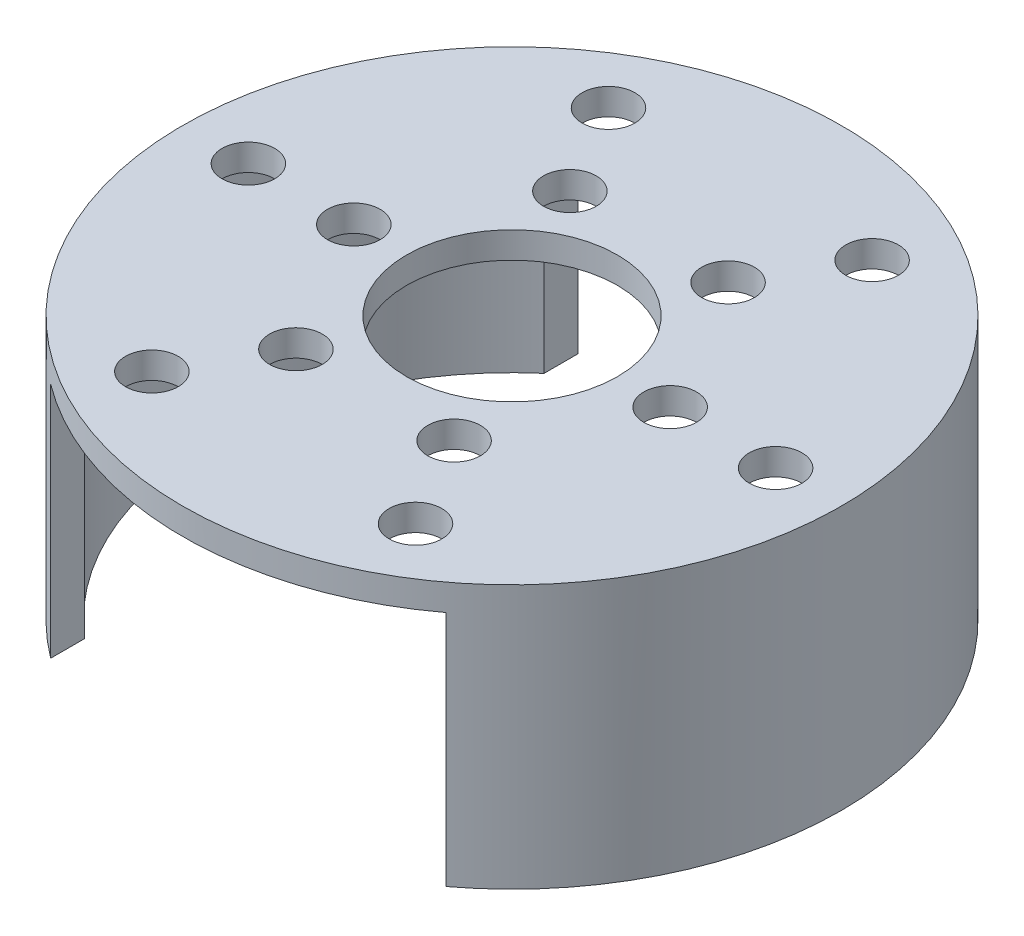
ISO-10303-21;
HEADER;
FILE_DESCRIPTION(('STEP AP214'),'2;1');
FILE_NAME('part.step','',(''),(''),'','','');
FILE_SCHEMA(('AUTOMOTIVE_DESIGN { 1 0 10303 214 1 1 1 1 }'));
ENDSEC;
DATA;
#1=APPLICATION_CONTEXT('core data for automotive mechanical design processes');
#2=APPLICATION_PROTOCOL_DEFINITION('international standard','automotive_design',2000,#1);
#3=PRODUCT_CONTEXT('',#1,'mechanical');
#4=PRODUCT('Part','Part','',(#3));
#5=PRODUCT_RELATED_PRODUCT_CATEGORY('part','',(#4));
#6=PRODUCT_DEFINITION_FORMATION('','',#4);
#7=PRODUCT_DEFINITION_CONTEXT('part definition',#1,'design');
#8=PRODUCT_DEFINITION('design','',#6,#7);
#9=PRODUCT_DEFINITION_SHAPE('','',#8);
#10=(LENGTH_UNIT() NAMED_UNIT(*) SI_UNIT(.MILLI.,.METRE.));
#11=(NAMED_UNIT(*) PLANE_ANGLE_UNIT() SI_UNIT($,.RADIAN.));
#12=(NAMED_UNIT(*) SI_UNIT($,.STERADIAN.) SOLID_ANGLE_UNIT());
#13=UNCERTAINTY_MEASURE_WITH_UNIT(LENGTH_MEASURE(1.E-05),#10,'distance_accuracy_value','');
#14=(GEOMETRIC_REPRESENTATION_CONTEXT(3) GLOBAL_UNCERTAINTY_ASSIGNED_CONTEXT((#13)) GLOBAL_UNIT_ASSIGNED_CONTEXT((#10,
#11,#12)) REPRESENTATION_CONTEXT('',''));
#15=CARTESIAN_POINT('',(0.,0.,0.));
#16=DIRECTION('',(0.,0.,1.));
#17=DIRECTION('',(1.,0.,0.));
#18=AXIS2_PLACEMENT_3D('',#15,#16,#17);
#19=CARTESIAN_POINT('',(0.,0.,0.));
#20=DIRECTION('',(0.,1.,0.));
#21=DIRECTION('',(0.,0.,1.));
#22=AXIS2_PLACEMENT_3D('',#19,#20,#21);
#23=PLANE('',#22);
#24=CARTESIAN_POINT('',(0.,0.,0.));
#25=DIRECTION('',(0.,1.,0.));
#26=DIRECTION('',(0.,0.,1.));
#27=AXIS2_PLACEMENT_3D('',#24,#25,#26);
#28=CIRCLE('',#27,12.5);
#29=CARTESIAN_POINT('',(-7.5,0.,-10.));
#30=VERTEX_POINT('',#29);
#31=CARTESIAN_POINT('',(-7.5,0.,10.));
#32=VERTEX_POINT('',#31);
#33=EDGE_CURVE('E150',#30,#32,#28,.T.);
#34=ORIENTED_EDGE('',*,*,#33,.F.);
#35=DIRECTION('',(0.,0.,1.));
#36=VECTOR('',#35,1.);
#37=CARTESIAN_POINT('',(-7.5,0.,-12.5));
#38=LINE('',#37,#36);
#39=CARTESIAN_POINT('',(-7.5,0.,-8.71779788708135));
#40=VERTEX_POINT('',#39);
#41=EDGE_CURVE('E196',#30,#40,#38,.T.);
#42=ORIENTED_EDGE('',*,*,#41,.T.);
#43=CARTESIAN_POINT('',(0.,0.,0.));
#44=DIRECTION('',(0.,1.,0.));
#45=DIRECTION('',(0.,0.,1.));
#46=AXIS2_PLACEMENT_3D('',#43,#44,#45);
#47=CIRCLE('',#46,11.5);
#48=CARTESIAN_POINT('',(-7.5,0.,8.71779788708135));
#49=VERTEX_POINT('',#48);
#50=EDGE_CURVE('E121',#40,#49,#47,.T.);
#51=ORIENTED_EDGE('',*,*,#50,.T.);
#52=EDGE_CURVE('E192',#49,#32,#38,.T.);
#53=ORIENTED_EDGE('',*,*,#52,.T.);
#54=EDGE_LOOP('',(#34,#42,#51,#53));
#55=FACE_BOUND('',#54,.T.);
#56=ADVANCED_FACE('F41',(#55),#23,.F.);
#57=CARTESIAN_POINT('',(0.,10.,0.));
#58=DIRECTION('',(0.,-1.,0.));
#59=DIRECTION('',(0.,0.,-1.));
#60=AXIS2_PLACEMENT_3D('',#57,#58,#59);
#61=CYLINDRICAL_SURFACE('',#60,11.5);
#62=DIRECTION('',(0.,-1.,0.));
#63=VECTOR('',#62,1.);
#64=CARTESIAN_POINT('',(-7.5,10.,-8.71779788708134));
#65=LINE('',#64,#63);
#66=CARTESIAN_POINT('',(-7.5,9.,-8.71779788708134));
#67=VERTEX_POINT('',#66);
#68=EDGE_CURVE('E141',#67,#40,#65,.T.);
#69=ORIENTED_EDGE('',*,*,#68,.F.);
#70=CARTESIAN_POINT('',(0.,9.,0.));
#71=DIRECTION('',(0.,1.,0.));
#72=DIRECTION('',(0.,0.,1.));
#73=AXIS2_PLACEMENT_3D('',#70,#71,#72);
#74=CIRCLE('',#73,11.5);
#75=CARTESIAN_POINT('',(-7.5,9.,8.71779788708134));
#76=VERTEX_POINT('',#75);
#77=EDGE_CURVE('E151',#67,#76,#74,.T.);
#78=ORIENTED_EDGE('',*,*,#77,.T.);
#79=DIRECTION('',(0.,-1.,0.));
#80=VECTOR('',#79,1.);
#81=CARTESIAN_POINT('',(-7.5,10.,8.71779788708134));
#82=LINE('',#81,#80);
#83=EDGE_CURVE('E135',#49,#76,#82,.F.);
#84=ORIENTED_EDGE('',*,*,#83,.F.);
#85=ORIENTED_EDGE('',*,*,#50,.F.);
#86=EDGE_LOOP('',(#69,#78,#84,#85));
#87=FACE_BOUND('',#86,.T.);
#88=ADVANCED_FACE('F220',(#87),#61,.F.);
#89=CARTESIAN_POINT('',(0.,10.,0.));
#90=DIRECTION('',(0.,-1.,0.));
#91=DIRECTION('',(0.,0.,-1.));
#92=AXIS2_PLACEMENT_3D('',#89,#90,#91);
#93=CYLINDRICAL_SURFACE('',#92,12.5);
#94=CARTESIAN_POINT('',(0.,10.,0.));
#95=DIRECTION('',(0.,1.,0.));
#96=DIRECTION('',(0.,0.,1.));
#97=AXIS2_PLACEMENT_3D('',#94,#95,#96);
#98=CIRCLE('',#97,12.5);
#99=CARTESIAN_POINT('',(0.,10.,12.5));
#100=VERTEX_POINT('',#99);
#101=EDGE_CURVE('E11',#100,#100,#98,.T.);
#102=ORIENTED_EDGE('',*,*,#101,.F.);
#103=EDGE_LOOP('',(#102));
#104=FACE_BOUND('',#103,.T.);
#105=CARTESIAN_POINT('',(0.,9.,0.));
#106=DIRECTION('',(0.,1.,0.));
#107=DIRECTION('',(0.,0.,1.));
#108=AXIS2_PLACEMENT_3D('',#105,#106,#107);
#109=CIRCLE('',#108,12.5);
#110=CARTESIAN_POINT('',(-7.5,9.,10.));
#111=VERTEX_POINT('',#110);
#112=CARTESIAN_POINT('',(7.5,9.,10.));
#113=VERTEX_POINT('',#112);
#114=EDGE_CURVE('E122',#111,#113,#109,.T.);
#115=ORIENTED_EDGE('',*,*,#114,.T.);
#116=DIRECTION('',(0.,-1.,0.));
#117=VECTOR('',#116,1.);
#118=CARTESIAN_POINT('',(7.5,10.,10.));
#119=LINE('',#118,#117);
#120=CARTESIAN_POINT('',(7.5,0.,10.));
#121=VERTEX_POINT('',#120);
#122=EDGE_CURVE('E132',#113,#121,#119,.T.);
#123=ORIENTED_EDGE('',*,*,#122,.T.);
#124=CARTESIAN_POINT('',(7.5,0.,-10.));
#125=VERTEX_POINT('',#124);
#126=EDGE_CURVE('E50',#121,#125,#28,.T.);
#127=ORIENTED_EDGE('',*,*,#126,.T.);
#128=DIRECTION('',(0.,-1.,0.));
#129=VECTOR('',#128,1.);
#130=CARTESIAN_POINT('',(7.5,10.,-10.));
#131=LINE('',#130,#129);
#132=CARTESIAN_POINT('',(7.5,9.,-10.));
#133=VERTEX_POINT('',#132);
#134=EDGE_CURVE('E125',#125,#133,#131,.F.);
#135=ORIENTED_EDGE('',*,*,#134,.T.);
#136=CARTESIAN_POINT('',(-7.5,9.,-10.));
#137=VERTEX_POINT('',#136);
#138=EDGE_CURVE('E109',#133,#137,#109,.T.);
#139=ORIENTED_EDGE('',*,*,#138,.T.);
#140=DIRECTION('',(0.,-1.,0.));
#141=VECTOR('',#140,1.);
#142=CARTESIAN_POINT('',(-7.5,10.,-10.));
#143=LINE('',#142,#141);
#144=EDGE_CURVE('E146',#137,#30,#143,.T.);
#145=ORIENTED_EDGE('',*,*,#144,.T.);
#146=ORIENTED_EDGE('',*,*,#33,.T.);
#147=DIRECTION('',(0.,-1.,0.));
#148=VECTOR('',#147,1.);
#149=CARTESIAN_POINT('',(-7.5,10.,10.));
#150=LINE('',#149,#148);
#151=EDGE_CURVE('E143',#32,#111,#150,.F.);
#152=ORIENTED_EDGE('',*,*,#151,.T.);
#153=EDGE_LOOP('',(#115,#123,#127,#135,#139,#145,#146,#152));
#154=FACE_BOUND('',#153,.T.);
#155=ADVANCED_FACE('F43',(#104,#154),#93,.T.);
#156=CARTESIAN_POINT('',(0.,10.,0.));
#157=DIRECTION('',(0.,1.,0.));
#158=DIRECTION('',(0.,0.,1.));
#159=AXIS2_PLACEMENT_3D('',#156,#157,#158);
#160=PLANE('',#159);
#161=CARTESIAN_POINT('',(0.,10.,0.));
#162=DIRECTION('',(0.,1.,0.));
#163=DIRECTION('',(0.,0.,1.));
#164=AXIS2_PLACEMENT_3D('',#161,#162,#163);
#165=CIRCLE('',#164,4.);
#166=CARTESIAN_POINT('',(0.,10.,4.));
#167=VERTEX_POINT('',#166);
#168=EDGE_CURVE('E246',#167,#167,#165,.T.);
#169=ORIENTED_EDGE('',*,*,#168,.F.);
#170=EDGE_LOOP('',(#169));
#171=FACE_BOUND('',#170,.T.);
#172=CARTESIAN_POINT('',(-10.,10.,0.));
#173=DIRECTION('',(0.,1.,0.));
#174=DIRECTION('',(0.,0.,1.));
#175=AXIS2_PLACEMENT_3D('',#172,#173,#174);
#176=CIRCLE('',#175,1.);
#177=CARTESIAN_POINT('',(-10.,10.,1.));
#178=VERTEX_POINT('',#177);
#179=EDGE_CURVE('E161',#178,#178,#176,.T.);
#180=ORIENTED_EDGE('',*,*,#179,.F.);
#181=EDGE_LOOP('',(#180));
#182=FACE_BOUND('',#181,.T.);
#183=CARTESIAN_POINT('',(2.99999999999995,10.,5.19615242270666));
#184=DIRECTION('',(0.,1.,0.));
#185=DIRECTION('',(0.,0.,1.));
#186=AXIS2_PLACEMENT_3D('',#183,#184,#185);
#187=CIRCLE('',#186,1.);
#188=CARTESIAN_POINT('',(2.99999999999995,10.,6.19615242270666));
#189=VERTEX_POINT('',#188);
#190=EDGE_CURVE('E253',#189,#189,#187,.T.);
#191=ORIENTED_EDGE('',*,*,#190,.F.);
#192=EDGE_LOOP('',(#191));
#193=FACE_BOUND('',#192,.T.);
#194=CARTESIAN_POINT('',(-5.0000000000001,10.,8.66025403784433));
#195=DIRECTION('',(0.,1.,0.));
#196=DIRECTION('',(0.,0.,1.));
#197=AXIS2_PLACEMENT_3D('',#194,#195,#196);
#198=CIRCLE('',#197,1.);
#199=CARTESIAN_POINT('',(-5.0000000000001,10.,9.66025403784433));
#200=VERTEX_POINT('',#199);
#201=EDGE_CURVE('E257',#200,#200,#198,.T.);
#202=ORIENTED_EDGE('',*,*,#201,.F.);
#203=EDGE_LOOP('',(#202));
#204=FACE_BOUND('',#203,.T.);
#205=CARTESIAN_POINT('',(-3.00000000000006,10.,5.1961524227066));
#206=DIRECTION('',(0.,1.,0.));
#207=DIRECTION('',(0.,0.,1.));
#208=AXIS2_PLACEMENT_3D('',#205,#206,#207);
#209=CIRCLE('',#208,1.);
#210=CARTESIAN_POINT('',(-3.00000000000006,10.,6.1961524227066));
#211=VERTEX_POINT('',#210);
#212=EDGE_CURVE('E261',#211,#211,#209,.T.);
#213=ORIENTED_EDGE('',*,*,#212,.F.);
#214=EDGE_LOOP('',(#213));
#215=FACE_BOUND('',#214,.T.);
#216=CARTESIAN_POINT('',(5.00000000000004,10.,-8.66025403784436));
#217=DIRECTION('',(0.,1.,0.));
#218=DIRECTION('',(0.,0.,1.));
#219=AXIS2_PLACEMENT_3D('',#216,#217,#218);
#220=CIRCLE('',#219,1.);
#221=CARTESIAN_POINT('',(5.00000000000004,10.,-7.66025403784436));
#222=VERTEX_POINT('',#221);
#223=EDGE_CURVE('E265',#222,#222,#220,.T.);
#224=ORIENTED_EDGE('',*,*,#223,.F.);
#225=EDGE_LOOP('',(#224));
#226=FACE_BOUND('',#225,.T.);
#227=CARTESIAN_POINT('',(-2.99999999999999,10.,-5.19615242270664));
#228=DIRECTION('',(0.,1.,0.));
#229=DIRECTION('',(0.,0.,1.));
#230=AXIS2_PLACEMENT_3D('',#227,#228,#229);
#231=CIRCLE('',#230,1.);
#232=CARTESIAN_POINT('',(-2.99999999999999,10.,-4.19615242270664));
#233=VERTEX_POINT('',#232);
#234=EDGE_CURVE('E269',#233,#233,#231,.T.);
#235=ORIENTED_EDGE('',*,*,#234,.F.);
#236=EDGE_LOOP('',(#235));
#237=FACE_BOUND('',#236,.T.);
#238=CARTESIAN_POINT('',(-4.99999999999998,10.,-8.6602540378444));
#239=DIRECTION('',(0.,1.,0.));
#240=DIRECTION('',(0.,0.,1.));
#241=AXIS2_PLACEMENT_3D('',#238,#239,#240);
#242=CIRCLE('',#241,1.);
#243=CARTESIAN_POINT('',(-4.99999999999998,10.,-7.6602540378444));
#244=VERTEX_POINT('',#243);
#245=EDGE_CURVE('E209',#244,#244,#242,.T.);
#246=ORIENTED_EDGE('',*,*,#245,.F.);
#247=EDGE_LOOP('',(#246));
#248=FACE_BOUND('',#247,.T.);
#249=CARTESIAN_POINT('',(-6.,10.,0.));
#250=DIRECTION('',(0.,1.,0.));
#251=DIRECTION('',(0.,0.,1.));
#252=AXIS2_PLACEMENT_3D('',#249,#250,#251);
#253=CIRCLE('',#252,1.);
#254=CARTESIAN_POINT('',(-6.,10.,1.));
#255=VERTEX_POINT('',#254);
#256=EDGE_CURVE('E276',#255,#255,#253,.T.);
#257=ORIENTED_EDGE('',*,*,#256,.F.);
#258=EDGE_LOOP('',(#257));
#259=FACE_BOUND('',#258,.T.);
#260=CARTESIAN_POINT('',(4.99999999999992,10.,8.66025403784444));
#261=DIRECTION('',(0.,1.,0.));
#262=DIRECTION('',(0.,0.,1.));
#263=AXIS2_PLACEMENT_3D('',#260,#261,#262);
#264=CIRCLE('',#263,1.);
#265=CARTESIAN_POINT('',(4.99999999999992,10.,9.66025403784444));
#266=VERTEX_POINT('',#265);
#267=EDGE_CURVE('E280',#266,#266,#264,.T.);
#268=ORIENTED_EDGE('',*,*,#267,.F.);
#269=EDGE_LOOP('',(#268));
#270=FACE_BOUND('',#269,.T.);
#271=CARTESIAN_POINT('',(6.,10.,0.));
#272=DIRECTION('',(0.,1.,0.));
#273=DIRECTION('',(0.,0.,1.));
#274=AXIS2_PLACEMENT_3D('',#271,#272,#273);
#275=CIRCLE('',#274,0.999999999999999);
#276=CARTESIAN_POINT('',(6.,10.,1.00000000000004));
#277=VERTEX_POINT('',#276);
#278=EDGE_CURVE('E284',#277,#277,#275,.T.);
#279=ORIENTED_EDGE('',*,*,#278,.F.);
#280=EDGE_LOOP('',(#279));
#281=FACE_BOUND('',#280,.T.);
#282=CARTESIAN_POINT('',(10.,10.,0.));
#283=DIRECTION('',(0.,1.,0.));
#284=DIRECTION('',(0.,0.,1.));
#285=AXIS2_PLACEMENT_3D('',#282,#283,#284);
#286=CIRCLE('',#285,0.999999999999999);
#287=CARTESIAN_POINT('',(10.,10.,1.00000000000007));
#288=VERTEX_POINT('',#287);
#289=EDGE_CURVE('E288',#288,#288,#286,.T.);
#290=ORIENTED_EDGE('',*,*,#289,.F.);
#291=EDGE_LOOP('',(#290));
#292=FACE_BOUND('',#291,.T.);
#293=CARTESIAN_POINT('',(3.00000000000002,10.,-5.19615242270662));
#294=DIRECTION('',(0.,1.,0.));
#295=DIRECTION('',(0.,0.,1.));
#296=AXIS2_PLACEMENT_3D('',#293,#294,#295);
#297=CIRCLE('',#296,0.999999999999999);
#298=CARTESIAN_POINT('',(3.00000000000002,10.,-4.19615242270662));
#299=VERTEX_POINT('',#298);
#300=EDGE_CURVE('E292',#299,#299,#297,.T.);
#301=ORIENTED_EDGE('',*,*,#300,.F.);
#302=EDGE_LOOP('',(#301));
#303=FACE_BOUND('',#302,.T.);
#304=ORIENTED_EDGE('',*,*,#101,.T.);
#305=EDGE_LOOP('',(#304));
#306=FACE_BOUND('',#305,.T.);
#307=ADVANCED_FACE('F228',(#171,#182,#193,#204,#215,#226,#237,#248,#259,#270,#281,#292,#303,
#306),#160,.T.);
#308=ORIENTED_EDGE('',*,*,#126,.F.);
#309=DIRECTION('',(0.,0.,1.));
#310=VECTOR('',#309,1.);
#311=CARTESIAN_POINT('',(7.5,0.,-12.5));
#312=LINE('',#311,#310);
#313=CARTESIAN_POINT('',(7.5,0.,8.71779788708135));
#314=VERTEX_POINT('',#313);
#315=EDGE_CURVE('E202',#314,#121,#312,.T.);
#316=ORIENTED_EDGE('',*,*,#315,.F.);
#317=CARTESIAN_POINT('',(7.5,0.,-8.71779788708135));
#318=VERTEX_POINT('',#317);
#319=EDGE_CURVE('E152',#314,#318,#47,.T.);
#320=ORIENTED_EDGE('',*,*,#319,.T.);
#321=EDGE_CURVE('E58',#125,#318,#312,.T.);
#322=ORIENTED_EDGE('',*,*,#321,.F.);
#323=EDGE_LOOP('',(#308,#316,#320,#322));
#324=FACE_BOUND('',#323,.T.);
#325=ADVANCED_FACE('F215',(#324),#23,.F.);
#326=DIRECTION('',(0.,-1.,0.));
#327=VECTOR('',#326,1.);
#328=CARTESIAN_POINT('',(7.5,10.,8.71779788708134));
#329=LINE('',#328,#327);
#330=CARTESIAN_POINT('',(7.5,9.,8.71779788708134));
#331=VERTEX_POINT('',#330);
#332=EDGE_CURVE('E133',#331,#314,#329,.T.);
#333=ORIENTED_EDGE('',*,*,#332,.F.);
#334=CARTESIAN_POINT('',(7.5,9.,-8.71779788708134));
#335=VERTEX_POINT('',#334);
#336=EDGE_CURVE('E148',#331,#335,#74,.T.);
#337=ORIENTED_EDGE('',*,*,#336,.T.);
#338=DIRECTION('',(0.,-1.,0.));
#339=VECTOR('',#338,1.);
#340=CARTESIAN_POINT('',(7.5,10.,-8.71779788708134));
#341=LINE('',#340,#339);
#342=EDGE_CURVE('E126',#318,#335,#341,.F.);
#343=ORIENTED_EDGE('',*,*,#342,.F.);
#344=ORIENTED_EDGE('',*,*,#319,.F.);
#345=EDGE_LOOP('',(#333,#337,#343,#344));
#346=FACE_BOUND('',#345,.T.);
#347=ADVANCED_FACE('F217',(#346),#61,.F.);
#348=CARTESIAN_POINT('',(0.,9.,0.));
#349=DIRECTION('',(0.,1.,0.));
#350=DIRECTION('',(0.,0.,1.));
#351=AXIS2_PLACEMENT_3D('',#348,#349,#350);
#352=PLANE('',#351);
#353=CARTESIAN_POINT('',(0.,9.,0.));
#354=DIRECTION('',(0.,1.,0.));
#355=DIRECTION('',(0.,0.,1.));
#356=AXIS2_PLACEMENT_3D('',#353,#354,#355);
#357=CIRCLE('',#356,4.);
#358=CARTESIAN_POINT('',(0.,9.,4.));
#359=VERTEX_POINT('',#358);
#360=EDGE_CURVE('E45',#359,#359,#357,.T.);
#361=ORIENTED_EDGE('',*,*,#360,.T.);
#362=EDGE_LOOP('',(#361));
#363=FACE_BOUND('',#362,.T.);
#364=CARTESIAN_POINT('',(-10.,9.,0.));
#365=DIRECTION('',(0.,1.,0.));
#366=DIRECTION('',(0.,0.,1.));
#367=AXIS2_PLACEMENT_3D('',#364,#365,#366);
#368=CIRCLE('',#367,1.);
#369=CARTESIAN_POINT('',(-10.,9.,1.));
#370=VERTEX_POINT('',#369);
#371=EDGE_CURVE('E190',#370,#370,#368,.T.);
#372=ORIENTED_EDGE('',*,*,#371,.T.);
#373=EDGE_LOOP('',(#372));
#374=FACE_BOUND('',#373,.T.);
#375=CARTESIAN_POINT('',(2.99999999999995,9.,5.19615242270666));
#376=DIRECTION('',(0.,1.,0.));
#377=DIRECTION('',(0.,0.,1.));
#378=AXIS2_PLACEMENT_3D('',#375,#376,#377);
#379=CIRCLE('',#378,1.);
#380=CARTESIAN_POINT('',(2.99999999999995,9.,6.19615242270666));
#381=VERTEX_POINT('',#380);
#382=EDGE_CURVE('E188',#381,#381,#379,.T.);
#383=ORIENTED_EDGE('',*,*,#382,.T.);
#384=EDGE_LOOP('',(#383));
#385=FACE_BOUND('',#384,.T.);
#386=CARTESIAN_POINT('',(-5.0000000000001,9.,8.66025403784433));
#387=DIRECTION('',(0.,1.,0.));
#388=DIRECTION('',(0.,0.,1.));
#389=AXIS2_PLACEMENT_3D('',#386,#387,#388);
#390=CIRCLE('',#389,1.);
#391=CARTESIAN_POINT('',(-5.0000000000001,9.,9.66025403784433));
#392=VERTEX_POINT('',#391);
#393=EDGE_CURVE('E185',#392,#392,#390,.T.);
#394=ORIENTED_EDGE('',*,*,#393,.T.);
#395=EDGE_LOOP('',(#394));
#396=FACE_BOUND('',#395,.T.);
#397=CARTESIAN_POINT('',(-3.00000000000006,9.,5.1961524227066));
#398=DIRECTION('',(0.,1.,0.));
#399=DIRECTION('',(0.,0.,1.));
#400=AXIS2_PLACEMENT_3D('',#397,#398,#399);
#401=CIRCLE('',#400,1.);
#402=CARTESIAN_POINT('',(-3.00000000000006,9.,6.1961524227066));
#403=VERTEX_POINT('',#402);
#404=EDGE_CURVE('E182',#403,#403,#401,.T.);
#405=ORIENTED_EDGE('',*,*,#404,.T.);
#406=EDGE_LOOP('',(#405));
#407=FACE_BOUND('',#406,.T.);
#408=CARTESIAN_POINT('',(5.00000000000004,9.,-8.66025403784436));
#409=DIRECTION('',(0.,1.,0.));
#410=DIRECTION('',(0.,0.,1.));
#411=AXIS2_PLACEMENT_3D('',#408,#409,#410);
#412=CIRCLE('',#411,1.);
#413=CARTESIAN_POINT('',(5.00000000000004,9.,-7.66025403784436));
#414=VERTEX_POINT('',#413);
#415=EDGE_CURVE('E179',#414,#414,#412,.T.);
#416=ORIENTED_EDGE('',*,*,#415,.T.);
#417=EDGE_LOOP('',(#416));
#418=FACE_BOUND('',#417,.T.);
#419=CARTESIAN_POINT('',(-2.99999999999999,9.,-5.19615242270664));
#420=DIRECTION('',(0.,1.,0.));
#421=DIRECTION('',(0.,0.,1.));
#422=AXIS2_PLACEMENT_3D('',#419,#420,#421);
#423=CIRCLE('',#422,1.);
#424=CARTESIAN_POINT('',(-2.99999999999999,9.,-4.19615242270664));
#425=VERTEX_POINT('',#424);
#426=EDGE_CURVE('E176',#425,#425,#423,.T.);
#427=ORIENTED_EDGE('',*,*,#426,.T.);
#428=EDGE_LOOP('',(#427));
#429=FACE_BOUND('',#428,.T.);
#430=CARTESIAN_POINT('',(-4.99999999999998,9.,-8.6602540378444));
#431=DIRECTION('',(0.,1.,0.));
#432=DIRECTION('',(0.,0.,1.));
#433=AXIS2_PLACEMENT_3D('',#430,#431,#432);
#434=CIRCLE('',#433,1.);
#435=CARTESIAN_POINT('',(-4.99999999999998,9.,-7.6602540378444));
#436=VERTEX_POINT('',#435);
#437=EDGE_CURVE('E173',#436,#436,#434,.T.);
#438=ORIENTED_EDGE('',*,*,#437,.T.);
#439=EDGE_LOOP('',(#438));
#440=FACE_BOUND('',#439,.T.);
#441=CARTESIAN_POINT('',(-6.,9.,0.));
#442=DIRECTION('',(0.,1.,0.));
#443=DIRECTION('',(0.,0.,1.));
#444=AXIS2_PLACEMENT_3D('',#441,#442,#443);
#445=CIRCLE('',#444,1.);
#446=CARTESIAN_POINT('',(-6.,9.,1.));
#447=VERTEX_POINT('',#446);
#448=EDGE_CURVE('E170',#447,#447,#445,.T.);
#449=ORIENTED_EDGE('',*,*,#448,.T.);
#450=EDGE_LOOP('',(#449));
#451=FACE_BOUND('',#450,.T.);
#452=CARTESIAN_POINT('',(4.99999999999992,9.,8.66025403784444));
#453=DIRECTION('',(0.,1.,0.));
#454=DIRECTION('',(0.,0.,1.));
#455=AXIS2_PLACEMENT_3D('',#452,#453,#454);
#456=CIRCLE('',#455,1.);
#457=CARTESIAN_POINT('',(4.99999999999992,9.,9.66025403784444));
#458=VERTEX_POINT('',#457);
#459=EDGE_CURVE('E167',#458,#458,#456,.T.);
#460=ORIENTED_EDGE('',*,*,#459,.T.);
#461=EDGE_LOOP('',(#460));
#462=FACE_BOUND('',#461,.T.);
#463=CARTESIAN_POINT('',(6.,9.,0.));
#464=DIRECTION('',(0.,1.,0.));
#465=DIRECTION('',(0.,0.,1.));
#466=AXIS2_PLACEMENT_3D('',#463,#464,#465);
#467=CIRCLE('',#466,0.999999999999999);
#468=CARTESIAN_POINT('',(6.,9.,1.00000000000004));
#469=VERTEX_POINT('',#468);
#470=EDGE_CURVE('E164',#469,#469,#467,.T.);
#471=ORIENTED_EDGE('',*,*,#470,.T.);
#472=EDGE_LOOP('',(#471));
#473=FACE_BOUND('',#472,.T.);
#474=CARTESIAN_POINT('',(10.,9.,0.));
#475=DIRECTION('',(0.,1.,0.));
#476=DIRECTION('',(0.,0.,1.));
#477=AXIS2_PLACEMENT_3D('',#474,#475,#476);
#478=CIRCLE('',#477,0.999999999999999);
#479=CARTESIAN_POINT('',(10.,9.,1.00000000000007));
#480=VERTEX_POINT('',#479);
#481=EDGE_CURVE('E160',#480,#480,#478,.T.);
#482=ORIENTED_EDGE('',*,*,#481,.T.);
#483=EDGE_LOOP('',(#482));
#484=FACE_BOUND('',#483,.T.);
#485=CARTESIAN_POINT('',(3.00000000000002,9.,-5.19615242270662));
#486=DIRECTION('',(0.,1.,0.));
#487=DIRECTION('',(0.,0.,1.));
#488=AXIS2_PLACEMENT_3D('',#485,#486,#487);
#489=CIRCLE('',#488,0.999999999999999);
#490=CARTESIAN_POINT('',(3.00000000000002,9.,-4.19615242270662));
#491=VERTEX_POINT('',#490);
#492=EDGE_CURVE('E157',#491,#491,#489,.T.);
#493=ORIENTED_EDGE('',*,*,#492,.T.);
#494=EDGE_LOOP('',(#493));
#495=FACE_BOUND('',#494,.T.);
#496=ORIENTED_EDGE('',*,*,#336,.F.);
#497=DIRECTION('',(0.,0.,1.));
#498=VECTOR('',#497,1.);
#499=CARTESIAN_POINT('',(7.5,9.,-12.5));
#500=LINE('',#499,#498);
#501=EDGE_CURVE('E66',#331,#113,#500,.T.);
#502=ORIENTED_EDGE('',*,*,#501,.T.);
#503=ORIENTED_EDGE('',*,*,#114,.F.);
#504=DIRECTION('',(0.,0.,1.));
#505=VECTOR('',#504,1.);
#506=CARTESIAN_POINT('',(-7.5,9.,-12.5));
#507=LINE('',#506,#505);
#508=EDGE_CURVE('E127',#76,#111,#507,.T.);
#509=ORIENTED_EDGE('',*,*,#508,.F.);
#510=ORIENTED_EDGE('',*,*,#77,.F.);
#511=EDGE_CURVE('E116',#137,#67,#507,.T.);
#512=ORIENTED_EDGE('',*,*,#511,.F.);
#513=ORIENTED_EDGE('',*,*,#138,.F.);
#514=EDGE_CURVE('E113',#133,#335,#500,.T.);
#515=ORIENTED_EDGE('',*,*,#514,.T.);
#516=EDGE_LOOP('',(#496,#502,#503,#509,#510,#512,#513,#515));
#517=FACE_BOUND('',#516,.T.);
#518=ADVANCED_FACE('F112',(#363,#374,#385,#396,#407,#418,#429,#440,#451,#462,#473,#484,#495,
#517),#352,.F.);
#519=CARTESIAN_POINT('',(7.5,9.,-12.5));
#520=DIRECTION('',(1.,0.,0.));
#521=DIRECTION('',(0.,1.,0.));
#522=AXIS2_PLACEMENT_3D('',#519,#520,#521);
#523=PLANE('',#522);
#524=ORIENTED_EDGE('',*,*,#321,.T.);
#525=ORIENTED_EDGE('',*,*,#342,.T.);
#526=ORIENTED_EDGE('',*,*,#514,.F.);
#527=ORIENTED_EDGE('',*,*,#134,.F.);
#528=EDGE_LOOP('',(#524,#525,#526,#527));
#529=FACE_BOUND('',#528,.T.);
#530=ADVANCED_FACE('F124',(#529),#523,.F.);
#531=CARTESIAN_POINT('',(-7.5,9.,-12.5));
#532=DIRECTION('',(-1.,0.,0.));
#533=DIRECTION('',(0.,-1.,0.));
#534=AXIS2_PLACEMENT_3D('',#531,#532,#533);
#535=PLANE('',#534);
#536=ORIENTED_EDGE('',*,*,#511,.T.);
#537=ORIENTED_EDGE('',*,*,#68,.T.);
#538=ORIENTED_EDGE('',*,*,#41,.F.);
#539=ORIENTED_EDGE('',*,*,#144,.F.);
#540=EDGE_LOOP('',(#536,#537,#538,#539));
#541=FACE_BOUND('',#540,.T.);
#542=ADVANCED_FACE('F349',(#541),#535,.F.);
#543=ORIENTED_EDGE('',*,*,#52,.F.);
#544=ORIENTED_EDGE('',*,*,#83,.T.);
#545=ORIENTED_EDGE('',*,*,#508,.T.);
#546=ORIENTED_EDGE('',*,*,#151,.F.);
#547=EDGE_LOOP('',(#543,#544,#545,#546));
#548=FACE_BOUND('',#547,.T.);
#549=ADVANCED_FACE('F334',(#548),#535,.F.);
#550=ORIENTED_EDGE('',*,*,#501,.F.);
#551=ORIENTED_EDGE('',*,*,#332,.T.);
#552=ORIENTED_EDGE('',*,*,#315,.T.);
#553=ORIENTED_EDGE('',*,*,#122,.F.);
#554=EDGE_LOOP('',(#550,#551,#552,#553));
#555=FACE_BOUND('',#554,.T.);
#556=ADVANCED_FACE('F212',(#555),#523,.F.);
#557=CARTESIAN_POINT('',(3.00000000000002,0.,-5.19615242270662));
#558=DIRECTION('',(0.,1.,0.));
#559=DIRECTION('',(0.,0.,1.));
#560=AXIS2_PLACEMENT_3D('',#557,#558,#559);
#561=CYLINDRICAL_SURFACE('',#560,0.999999999999999);
#562=ORIENTED_EDGE('',*,*,#300,.T.);
#563=EDGE_LOOP('',(#562));
#564=FACE_BOUND('',#563,.T.);
#565=ORIENTED_EDGE('',*,*,#492,.F.);
#566=EDGE_LOOP('',(#565));
#567=FACE_BOUND('',#566,.T.);
#568=ADVANCED_FACE('F323',(#564,#567),#561,.F.);
#569=CARTESIAN_POINT('',(10.,0.,0.));
#570=DIRECTION('',(0.,1.,0.));
#571=DIRECTION('',(0.,0.,1.));
#572=AXIS2_PLACEMENT_3D('',#569,#570,#571);
#573=CYLINDRICAL_SURFACE('',#572,0.999999999999999);
#574=ORIENTED_EDGE('',*,*,#289,.T.);
#575=EDGE_LOOP('',(#574));
#576=FACE_BOUND('',#575,.T.);
#577=ORIENTED_EDGE('',*,*,#481,.F.);
#578=EDGE_LOOP('',(#577));
#579=FACE_BOUND('',#578,.T.);
#580=ADVANCED_FACE('F325',(#576,#579),#573,.F.);
#581=CARTESIAN_POINT('',(6.,0.,0.));
#582=DIRECTION('',(0.,1.,0.));
#583=DIRECTION('',(0.,0.,1.));
#584=AXIS2_PLACEMENT_3D('',#581,#582,#583);
#585=CYLINDRICAL_SURFACE('',#584,0.999999999999999);
#586=ORIENTED_EDGE('',*,*,#278,.T.);
#587=EDGE_LOOP('',(#586));
#588=FACE_BOUND('',#587,.T.);
#589=ORIENTED_EDGE('',*,*,#470,.F.);
#590=EDGE_LOOP('',(#589));
#591=FACE_BOUND('',#590,.T.);
#592=ADVANCED_FACE('F331',(#588,#591),#585,.F.);
#593=CARTESIAN_POINT('',(4.99999999999992,0.,8.66025403784444));
#594=DIRECTION('',(0.,1.,0.));
#595=DIRECTION('',(0.,0.,1.));
#596=AXIS2_PLACEMENT_3D('',#593,#594,#595);
#597=CYLINDRICAL_SURFACE('',#596,1.);
#598=ORIENTED_EDGE('',*,*,#267,.T.);
#599=EDGE_LOOP('',(#598));
#600=FACE_BOUND('',#599,.T.);
#601=ORIENTED_EDGE('',*,*,#459,.F.);
#602=EDGE_LOOP('',(#601));
#603=FACE_BOUND('',#602,.T.);
#604=ADVANCED_FACE('F337',(#600,#603),#597,.F.);
#605=CARTESIAN_POINT('',(-6.,0.,0.));
#606=DIRECTION('',(0.,1.,0.));
#607=DIRECTION('',(0.,0.,1.));
#608=AXIS2_PLACEMENT_3D('',#605,#606,#607);
#609=CYLINDRICAL_SURFACE('',#608,1.);
#610=ORIENTED_EDGE('',*,*,#256,.T.);
#611=EDGE_LOOP('',(#610));
#612=FACE_BOUND('',#611,.T.);
#613=ORIENTED_EDGE('',*,*,#448,.F.);
#614=EDGE_LOOP('',(#613));
#615=FACE_BOUND('',#614,.T.);
#616=ADVANCED_FACE('F308',(#612,#615),#609,.F.);
#617=CARTESIAN_POINT('',(-4.99999999999998,0.,-8.6602540378444));
#618=DIRECTION('',(0.,1.,0.));
#619=DIRECTION('',(0.,0.,1.));
#620=AXIS2_PLACEMENT_3D('',#617,#618,#619);
#621=CYLINDRICAL_SURFACE('',#620,1.);
#622=ORIENTED_EDGE('',*,*,#245,.T.);
#623=EDGE_LOOP('',(#622));
#624=FACE_BOUND('',#623,.T.);
#625=ORIENTED_EDGE('',*,*,#437,.F.);
#626=EDGE_LOOP('',(#625));
#627=FACE_BOUND('',#626,.T.);
#628=ADVANCED_FACE('F304',(#624,#627),#621,.F.);
#629=CARTESIAN_POINT('',(-2.99999999999999,0.,-5.19615242270664));
#630=DIRECTION('',(0.,1.,0.));
#631=DIRECTION('',(0.,0.,1.));
#632=AXIS2_PLACEMENT_3D('',#629,#630,#631);
#633=CYLINDRICAL_SURFACE('',#632,1.);
#634=ORIENTED_EDGE('',*,*,#234,.T.);
#635=EDGE_LOOP('',(#634));
#636=FACE_BOUND('',#635,.T.);
#637=ORIENTED_EDGE('',*,*,#426,.F.);
#638=EDGE_LOOP('',(#637));
#639=FACE_BOUND('',#638,.T.);
#640=ADVANCED_FACE('F307',(#636,#639),#633,.F.);
#641=CARTESIAN_POINT('',(5.00000000000004,0.,-8.66025403784436));
#642=DIRECTION('',(0.,1.,0.));
#643=DIRECTION('',(0.,0.,1.));
#644=AXIS2_PLACEMENT_3D('',#641,#642,#643);
#645=CYLINDRICAL_SURFACE('',#644,1.);
#646=ORIENTED_EDGE('',*,*,#223,.T.);
#647=EDGE_LOOP('',(#646));
#648=FACE_BOUND('',#647,.T.);
#649=ORIENTED_EDGE('',*,*,#415,.F.);
#650=EDGE_LOOP('',(#649));
#651=FACE_BOUND('',#650,.T.);
#652=ADVANCED_FACE('F342',(#648,#651),#645,.F.);
#653=CARTESIAN_POINT('',(-3.00000000000006,0.,5.1961524227066));
#654=DIRECTION('',(0.,1.,0.));
#655=DIRECTION('',(0.,0.,1.));
#656=AXIS2_PLACEMENT_3D('',#653,#654,#655);
#657=CYLINDRICAL_SURFACE('',#656,1.);
#658=ORIENTED_EDGE('',*,*,#212,.T.);
#659=EDGE_LOOP('',(#658));
#660=FACE_BOUND('',#659,.T.);
#661=ORIENTED_EDGE('',*,*,#404,.F.);
#662=EDGE_LOOP('',(#661));
#663=FACE_BOUND('',#662,.T.);
#664=ADVANCED_FACE('F346',(#660,#663),#657,.F.);
#665=CARTESIAN_POINT('',(-5.0000000000001,0.,8.66025403784433));
#666=DIRECTION('',(0.,1.,0.));
#667=DIRECTION('',(0.,0.,1.));
#668=AXIS2_PLACEMENT_3D('',#665,#666,#667);
#669=CYLINDRICAL_SURFACE('',#668,1.);
#670=ORIENTED_EDGE('',*,*,#201,.T.);
#671=EDGE_LOOP('',(#670));
#672=FACE_BOUND('',#671,.T.);
#673=ORIENTED_EDGE('',*,*,#393,.F.);
#674=EDGE_LOOP('',(#673));
#675=FACE_BOUND('',#674,.T.);
#676=ADVANCED_FACE('F412',(#672,#675),#669,.F.);
#677=CARTESIAN_POINT('',(2.99999999999995,0.,5.19615242270666));
#678=DIRECTION('',(0.,1.,0.));
#679=DIRECTION('',(0.,0.,1.));
#680=AXIS2_PLACEMENT_3D('',#677,#678,#679);
#681=CYLINDRICAL_SURFACE('',#680,1.);
#682=ORIENTED_EDGE('',*,*,#190,.T.);
#683=EDGE_LOOP('',(#682));
#684=FACE_BOUND('',#683,.T.);
#685=ORIENTED_EDGE('',*,*,#382,.F.);
#686=EDGE_LOOP('',(#685));
#687=FACE_BOUND('',#686,.T.);
#688=ADVANCED_FACE('F420',(#684,#687),#681,.F.);
#689=CARTESIAN_POINT('',(-10.,0.,0.));
#690=DIRECTION('',(0.,1.,0.));
#691=DIRECTION('',(0.,0.,1.));
#692=AXIS2_PLACEMENT_3D('',#689,#690,#691);
#693=CYLINDRICAL_SURFACE('',#692,1.);
#694=ORIENTED_EDGE('',*,*,#179,.T.);
#695=EDGE_LOOP('',(#694));
#696=FACE_BOUND('',#695,.T.);
#697=ORIENTED_EDGE('',*,*,#371,.F.);
#698=EDGE_LOOP('',(#697));
#699=FACE_BOUND('',#698,.T.);
#700=ADVANCED_FACE('F428',(#696,#699),#693,.F.);
#701=CARTESIAN_POINT('',(0.,0.,0.));
#702=DIRECTION('',(0.,1.,0.));
#703=DIRECTION('',(0.,0.,1.));
#704=AXIS2_PLACEMENT_3D('',#701,#702,#703);
#705=CYLINDRICAL_SURFACE('',#704,4.);
#706=ORIENTED_EDGE('',*,*,#168,.T.);
#707=EDGE_LOOP('',(#706));
#708=FACE_BOUND('',#707,.T.);
#709=ORIENTED_EDGE('',*,*,#360,.F.);
#710=EDGE_LOOP('',(#709));
#711=FACE_BOUND('',#710,.T.);
#712=ADVANCED_FACE('F435',(#708,#711),#705,.F.);
#713=CLOSED_SHELL('',(#56,#88,#155,#307,#325,#347,#518,#530,#542,#549,#556,#568,#580,#592,#604,
#616,#628,#640,#652,#664,#676,#688,#700,#712));
#714=MANIFOLD_SOLID_BREP('B2',#713);
#715=ADVANCED_BREP_SHAPE_REPRESENTATION('',(#18,#714),#14);
#716=SHAPE_DEFINITION_REPRESENTATION(#9,#715);
ENDSEC;
END-ISO-10303-21;
